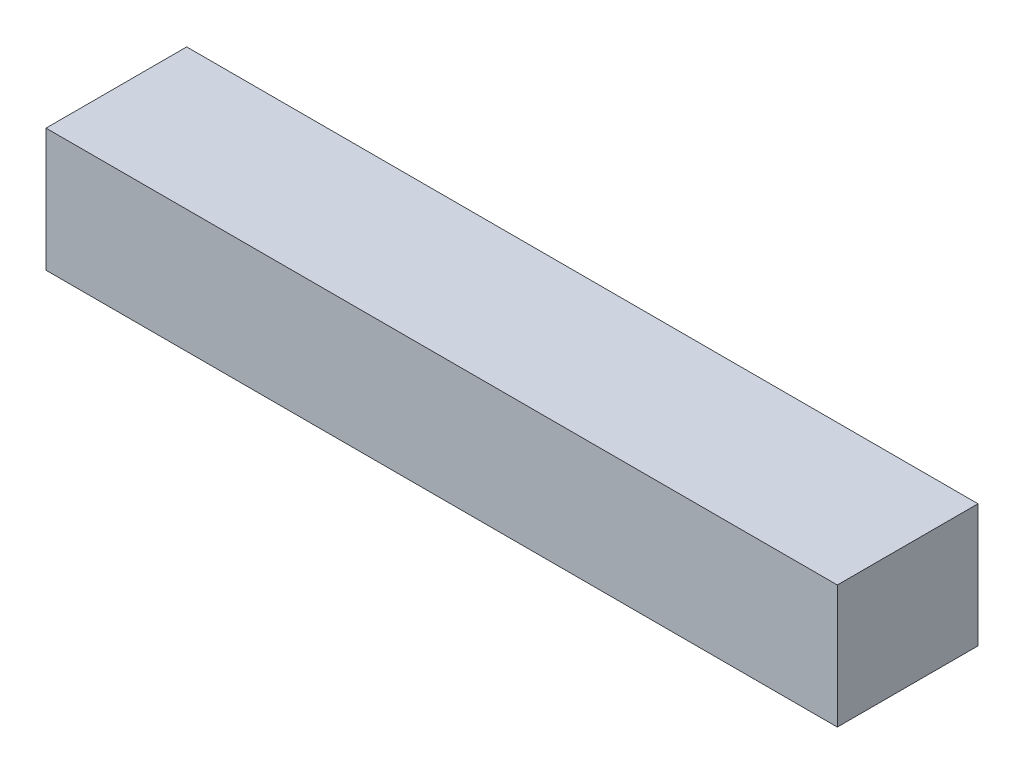
ISO-10303-21;
HEADER;
FILE_DESCRIPTION(('STEP AP214'),'2;1');
FILE_NAME('part.step','',(''),(''),'','','');
FILE_SCHEMA(('AUTOMOTIVE_DESIGN { 1 0 10303 214 1 1 1 1 }'));
ENDSEC;
DATA;
#1=APPLICATION_CONTEXT('core data for automotive mechanical design processes');
#2=APPLICATION_PROTOCOL_DEFINITION('international standard','automotive_design',2000,#1);
#3=PRODUCT_CONTEXT('',#1,'mechanical');
#4=PRODUCT('Part','Part','',(#3));
#5=PRODUCT_RELATED_PRODUCT_CATEGORY('part','',(#4));
#6=PRODUCT_DEFINITION_FORMATION('','',#4);
#7=PRODUCT_DEFINITION_CONTEXT('part definition',#1,'design');
#8=PRODUCT_DEFINITION('design','',#6,#7);
#9=PRODUCT_DEFINITION_SHAPE('','',#8);
#10=(LENGTH_UNIT() NAMED_UNIT(*) SI_UNIT(.MILLI.,.METRE.));
#11=(NAMED_UNIT(*) PLANE_ANGLE_UNIT() SI_UNIT($,.RADIAN.));
#12=(NAMED_UNIT(*) SI_UNIT($,.STERADIAN.) SOLID_ANGLE_UNIT());
#13=UNCERTAINTY_MEASURE_WITH_UNIT(LENGTH_MEASURE(1.E-05),#10,'distance_accuracy_value','');
#14=(GEOMETRIC_REPRESENTATION_CONTEXT(3) GLOBAL_UNCERTAINTY_ASSIGNED_CONTEXT((#13)) GLOBAL_UNIT_ASSIGNED_CONTEXT((#10,
#11,#12)) REPRESENTATION_CONTEXT('',''));
#15=CARTESIAN_POINT('',(0.,0.,0.));
#16=DIRECTION('',(0.,0.,1.));
#17=DIRECTION('',(1.,0.,0.));
#18=AXIS2_PLACEMENT_3D('',#15,#16,#17);
#19=CARTESIAN_POINT('',(45.,0.,0.));
#20=DIRECTION('',(0.,1.,0.));
#21=DIRECTION('',(0.,0.,1.));
#22=AXIS2_PLACEMENT_3D('',#19,#20,#21);
#23=PLANE('',#22);
#24=DIRECTION('',(0.,0.,-1.));
#25=VECTOR('',#24,1.);
#26=CARTESIAN_POINT('',(0.,0.,0.));
#27=LINE('',#26,#25);
#28=CARTESIAN_POINT('',(0.,0.,0.));
#29=VERTEX_POINT('',#28);
#30=CARTESIAN_POINT('',(0.,0.,-8.));
#31=VERTEX_POINT('',#30);
#32=EDGE_CURVE('E113',#29,#31,#27,.T.);
#33=ORIENTED_EDGE('',*,*,#32,.T.);
#34=DIRECTION('',(-1.,0.,0.));
#35=VECTOR('',#34,1.);
#36=CARTESIAN_POINT('',(45.,0.,-8.));
#37=LINE('',#36,#35);
#38=CARTESIAN_POINT('',(45.,0.,-8.));
#39=VERTEX_POINT('',#38);
#40=EDGE_CURVE('E11',#39,#31,#37,.T.);
#41=ORIENTED_EDGE('',*,*,#40,.F.);
#42=DIRECTION('',(0.,0.,-1.));
#43=VECTOR('',#42,1.);
#44=CARTESIAN_POINT('',(45.,0.,0.));
#45=LINE('',#44,#43);
#46=CARTESIAN_POINT('',(45.,0.,0.));
#47=VERTEX_POINT('',#46);
#48=EDGE_CURVE('E95',#47,#39,#45,.T.);
#49=ORIENTED_EDGE('',*,*,#48,.F.);
#50=DIRECTION('',(-1.,0.,0.));
#51=VECTOR('',#50,1.);
#52=CARTESIAN_POINT('',(45.,0.,0.));
#53=LINE('',#52,#51);
#54=EDGE_CURVE('E62',#47,#29,#53,.T.);
#55=ORIENTED_EDGE('',*,*,#54,.T.);
#56=EDGE_LOOP('',(#33,#41,#49,#55));
#57=FACE_BOUND('',#56,.T.);
#58=ADVANCED_FACE('F45',(#57),#23,.F.);
#59=CARTESIAN_POINT('',(45.,0.,-8.));
#60=DIRECTION('',(0.,0.,1.));
#61=DIRECTION('',(1.,0.,0.));
#62=AXIS2_PLACEMENT_3D('',#59,#60,#61);
#63=PLANE('',#62);
#64=DIRECTION('',(0.,1.,0.));
#65=VECTOR('',#64,1.);
#66=CARTESIAN_POINT('',(0.,0.,-8.));
#67=LINE('',#66,#65);
#68=CARTESIAN_POINT('',(0.,7.,-8.));
#69=VERTEX_POINT('',#68);
#70=EDGE_CURVE('E101',#31,#69,#67,.T.);
#71=ORIENTED_EDGE('',*,*,#70,.T.);
#72=DIRECTION('',(-1.,0.,0.));
#73=VECTOR('',#72,1.);
#74=CARTESIAN_POINT('',(45.,7.,-8.));
#75=LINE('',#74,#73);
#76=CARTESIAN_POINT('',(45.,7.,-8.));
#77=VERTEX_POINT('',#76);
#78=EDGE_CURVE('E54',#77,#69,#75,.T.);
#79=ORIENTED_EDGE('',*,*,#78,.F.);
#80=DIRECTION('',(0.,1.,0.));
#81=VECTOR('',#80,1.);
#82=CARTESIAN_POINT('',(45.,0.,-8.));
#83=LINE('',#82,#81);
#84=EDGE_CURVE('E87',#39,#77,#83,.T.);
#85=ORIENTED_EDGE('',*,*,#84,.F.);
#86=ORIENTED_EDGE('',*,*,#40,.T.);
#87=EDGE_LOOP('',(#71,#79,#85,#86));
#88=FACE_BOUND('',#87,.T.);
#89=ADVANCED_FACE('F100',(#88),#63,.F.);
#90=CARTESIAN_POINT('',(45.,7.,0.));
#91=DIRECTION('',(0.,1.,0.));
#92=DIRECTION('',(0.,0.,1.));
#93=AXIS2_PLACEMENT_3D('',#90,#91,#92);
#94=PLANE('',#93);
#95=DIRECTION('',(0.,0.,-1.));
#96=VECTOR('',#95,1.);
#97=CARTESIAN_POINT('',(0.,7.,0.));
#98=LINE('',#97,#96);
#99=CARTESIAN_POINT('',(0.,7.,0.));
#100=VERTEX_POINT('',#99);
#101=EDGE_CURVE('E118',#100,#69,#98,.T.);
#102=ORIENTED_EDGE('',*,*,#101,.F.);
#103=DIRECTION('',(-1.,0.,0.));
#104=VECTOR('',#103,1.);
#105=CARTESIAN_POINT('',(45.,7.,0.));
#106=LINE('',#105,#104);
#107=CARTESIAN_POINT('',(45.,7.,0.));
#108=VERTEX_POINT('',#107);
#109=EDGE_CURVE('E76',#108,#100,#106,.T.);
#110=ORIENTED_EDGE('',*,*,#109,.F.);
#111=DIRECTION('',(0.,0.,-1.));
#112=VECTOR('',#111,1.);
#113=CARTESIAN_POINT('',(45.,7.,0.));
#114=LINE('',#113,#112);
#115=EDGE_CURVE('E94',#108,#77,#114,.T.);
#116=ORIENTED_EDGE('',*,*,#115,.T.);
#117=ORIENTED_EDGE('',*,*,#78,.T.);
#118=EDGE_LOOP('',(#102,#110,#116,#117));
#119=FACE_BOUND('',#118,.T.);
#120=ADVANCED_FACE('F105',(#119),#94,.T.);
#121=CARTESIAN_POINT('',(45.,0.,0.));
#122=DIRECTION('',(0.,0.,1.));
#123=DIRECTION('',(1.,0.,0.));
#124=AXIS2_PLACEMENT_3D('',#121,#122,#123);
#125=PLANE('',#124);
#126=DIRECTION('',(0.,1.,0.));
#127=VECTOR('',#126,1.);
#128=CARTESIAN_POINT('',(0.,0.,0.));
#129=LINE('',#128,#127);
#130=EDGE_CURVE('E121',#29,#100,#129,.T.);
#131=ORIENTED_EDGE('',*,*,#130,.F.);
#132=ORIENTED_EDGE('',*,*,#54,.F.);
#133=DIRECTION('',(0.,1.,0.));
#134=VECTOR('',#133,1.);
#135=CARTESIAN_POINT('',(45.,0.,0.));
#136=LINE('',#135,#134);
#137=EDGE_CURVE('E107',#47,#108,#136,.T.);
#138=ORIENTED_EDGE('',*,*,#137,.T.);
#139=ORIENTED_EDGE('',*,*,#109,.T.);
#140=EDGE_LOOP('',(#131,#132,#138,#139));
#141=FACE_BOUND('',#140,.T.);
#142=ADVANCED_FACE('F131',(#141),#125,.T.);
#143=CARTESIAN_POINT('',(45.,0.,0.));
#144=DIRECTION('',(1.,0.,0.));
#145=DIRECTION('',(0.,0.,-1.));
#146=AXIS2_PLACEMENT_3D('',#143,#144,#145);
#147=PLANE('',#146);
#148=ORIENTED_EDGE('',*,*,#48,.T.);
#149=ORIENTED_EDGE('',*,*,#84,.T.);
#150=ORIENTED_EDGE('',*,*,#115,.F.);
#151=ORIENTED_EDGE('',*,*,#137,.F.);
#152=EDGE_LOOP('',(#148,#149,#150,#151));
#153=FACE_BOUND('',#152,.T.);
#154=ADVANCED_FACE('F91',(#153),#147,.T.);
#155=CARTESIAN_POINT('',(0.,0.,0.));
#156=DIRECTION('',(1.,0.,0.));
#157=DIRECTION('',(0.,0.,-1.));
#158=AXIS2_PLACEMENT_3D('',#155,#156,#157);
#159=PLANE('',#158);
#160=ORIENTED_EDGE('',*,*,#32,.F.);
#161=ORIENTED_EDGE('',*,*,#130,.T.);
#162=ORIENTED_EDGE('',*,*,#101,.T.);
#163=ORIENTED_EDGE('',*,*,#70,.F.);
#164=EDGE_LOOP('',(#160,#161,#162,#163));
#165=FACE_BOUND('',#164,.T.);
#166=ADVANCED_FACE('F130',(#165),#159,.F.);
#167=CLOSED_SHELL('',(#58,#89,#120,#142,#154,#166));
#168=MANIFOLD_SOLID_BREP('B2',#167);
#169=ADVANCED_BREP_SHAPE_REPRESENTATION('',(#18,#168),#14);
#170=SHAPE_DEFINITION_REPRESENTATION(#9,#169);
ENDSEC;
END-ISO-10303-21;
